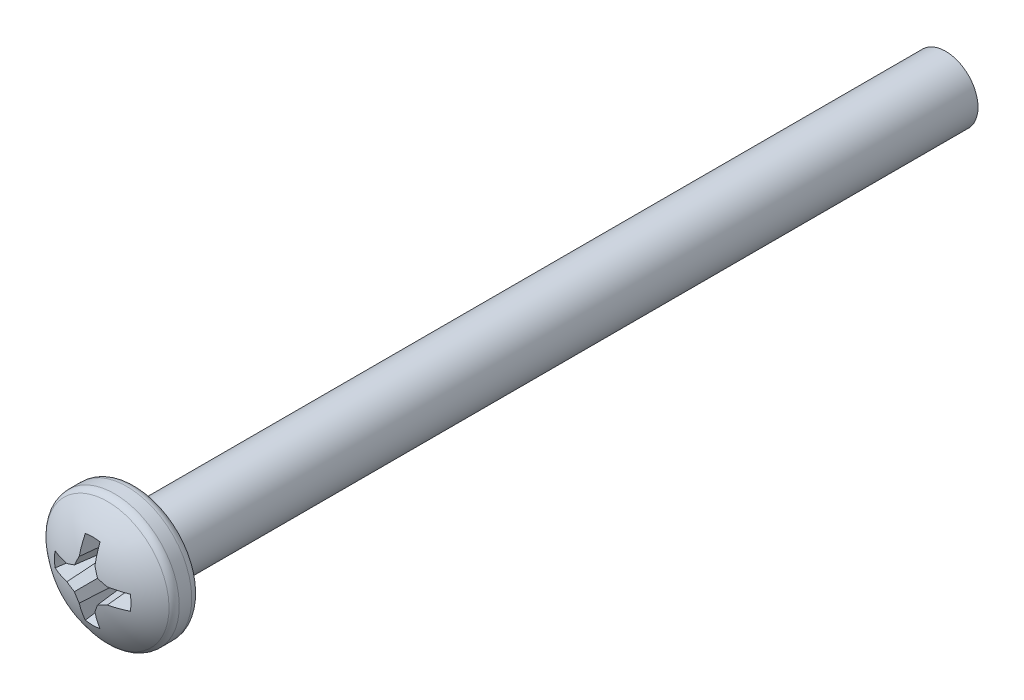
ISO-10303-21;
HEADER;
FILE_DESCRIPTION(('STEP AP214'),'2;1');
FILE_NAME('part.step','',(''),(''),'','','');
FILE_SCHEMA(('AUTOMOTIVE_DESIGN { 1 0 10303 214 1 1 1 1 }'));
ENDSEC;
DATA;
#1=APPLICATION_CONTEXT('core data for automotive mechanical design processes');
#2=APPLICATION_PROTOCOL_DEFINITION('international standard','automotive_design',2000,#1);
#3=PRODUCT_CONTEXT('',#1,'mechanical');
#4=PRODUCT('Part','Part','',(#3));
#5=PRODUCT_RELATED_PRODUCT_CATEGORY('part','',(#4));
#6=PRODUCT_DEFINITION_FORMATION('','',#4);
#7=PRODUCT_DEFINITION_CONTEXT('part definition',#1,'design');
#8=PRODUCT_DEFINITION('design','',#6,#7);
#9=PRODUCT_DEFINITION_SHAPE('','',#8);
#10=(LENGTH_UNIT() NAMED_UNIT(*) SI_UNIT(.MILLI.,.METRE.));
#11=(NAMED_UNIT(*) PLANE_ANGLE_UNIT() SI_UNIT($,.RADIAN.));
#12=(NAMED_UNIT(*) SI_UNIT($,.STERADIAN.) SOLID_ANGLE_UNIT());
#13=UNCERTAINTY_MEASURE_WITH_UNIT(LENGTH_MEASURE(1.E-05),#10,'distance_accuracy_value','');
#14=(GEOMETRIC_REPRESENTATION_CONTEXT(3) GLOBAL_UNCERTAINTY_ASSIGNED_CONTEXT((#13)) GLOBAL_UNIT_ASSIGNED_CONTEXT((#10,
#11,#12)) REPRESENTATION_CONTEXT('',''));
#15=CARTESIAN_POINT('',(0.,0.,0.));
#16=DIRECTION('',(0.,0.,1.));
#17=DIRECTION('',(1.,0.,0.));
#18=AXIS2_PLACEMENT_3D('',#15,#16,#17);
#19=CARTESIAN_POINT('',(0.,0.,50.));
#20=DIRECTION('',(0.,0.,-1.));
#21=DIRECTION('',(-1.,0.,0.));
#22=AXIS2_PLACEMENT_3D('',#19,#20,#21);
#23=PLANE('',#22);
#24=CARTESIAN_POINT('',(0.,0.,50.));
#25=DIRECTION('',(0.,0.,1.));
#26=DIRECTION('',(1.,0.,0.));
#27=AXIS2_PLACEMENT_3D('',#24,#25,#26);
#28=CIRCLE('',#27,1.99999999999999);
#29=CARTESIAN_POINT('',(1.99999999999999,0.,50.));
#30=VERTEX_POINT('',#29);
#31=EDGE_CURVE('E672',#30,#30,#28,.T.);
#32=ORIENTED_EDGE('',*,*,#31,.T.);
#33=EDGE_LOOP('',(#32));
#34=FACE_BOUND('',#33,.T.);
#35=CARTESIAN_POINT('',(0.,0.,50.));
#36=DIRECTION('',(0.,0.,1.));
#37=DIRECTION('',(0.,-1.,0.));
#38=AXIS2_PLACEMENT_3D('',#35,#36,#37);
#39=CIRCLE('',#38,3.424);
#40=CARTESIAN_POINT('',(0.,-3.42400000000001,50.));
#41=VERTEX_POINT('',#40);
#42=EDGE_CURVE('E658',#41,#41,#39,.T.);
#43=ORIENTED_EDGE('',*,*,#42,.F.);
#44=EDGE_LOOP('',(#43));
#45=FACE_BOUND('',#44,.T.);
#46=ADVANCED_FACE('F36',(#34,#45),#23,.T.);
#47=CARTESIAN_POINT('',(0.,0.,0.));
#48=DIRECTION('',(0.,0.,1.));
#49=DIRECTION('',(1.,0.,0.));
#50=AXIS2_PLACEMENT_3D('',#47,#48,#49);
#51=PLANE('',#50);
#52=CARTESIAN_POINT('',(0.,0.,0.));
#53=DIRECTION('',(0.,0.,1.));
#54=DIRECTION('',(1.,0.,0.));
#55=AXIS2_PLACEMENT_3D('',#52,#53,#54);
#56=CIRCLE('',#55,2.);
#57=CARTESIAN_POINT('',(2.,0.,0.));
#58=VERTEX_POINT('',#57);
#59=EDGE_CURVE('E386',#58,#58,#56,.T.);
#60=ORIENTED_EDGE('',*,*,#59,.F.);
#61=EDGE_LOOP('',(#60));
#62=FACE_BOUND('',#61,.T.);
#63=ADVANCED_FACE('F222',(#62),#51,.F.);
#64=CARTESIAN_POINT('',(0.,0.,0.));
#65=DIRECTION('',(0.,0.,1.));
#66=DIRECTION('',(1.,0.,0.));
#67=AXIS2_PLACEMENT_3D('',#64,#65,#66);
#68=CYLINDRICAL_SURFACE('',#67,2.);
#69=ORIENTED_EDGE('',*,*,#31,.F.);
#70=EDGE_LOOP('',(#69));
#71=FACE_BOUND('',#70,.T.);
#72=ORIENTED_EDGE('',*,*,#59,.T.);
#73=EDGE_LOOP('',(#72));
#74=FACE_BOUND('',#73,.T.);
#75=ADVANCED_FACE('F228',(#71,#74),#68,.T.);
#76=CARTESIAN_POINT('',(0.,0.,50.576));
#77=DIRECTION('',(0.,0.,1.));
#78=DIRECTION('',(0.,-1.,0.));
#79=AXIS2_PLACEMENT_3D('',#76,#77,#78);
#80=TOROIDAL_SURFACE('',#79,3.424,0.576000000000001);
#81=ORIENTED_EDGE('',*,*,#42,.T.);
#82=EDGE_LOOP('',(#81));
#83=FACE_BOUND('',#82,.T.);
#84=CARTESIAN_POINT('',(0.,0.,50.576));
#85=DIRECTION('',(0.,0.,1.));
#86=DIRECTION('',(0.,-1.,0.));
#87=AXIS2_PLACEMENT_3D('',#84,#85,#86);
#88=CIRCLE('',#87,4.);
#89=CARTESIAN_POINT('',(0.,-4.00000000000001,50.576));
#90=VERTEX_POINT('',#89);
#91=EDGE_CURVE('E661',#90,#90,#88,.T.);
#92=ORIENTED_EDGE('',*,*,#91,.F.);
#93=EDGE_LOOP('',(#92));
#94=FACE_BOUND('',#93,.T.);
#95=ADVANCED_FACE('F239',(#83,#94),#80,.T.);
#96=CARTESIAN_POINT('',(0.,0.,0.));
#97=DIRECTION('',(0.,0.,-1.));
#98=DIRECTION('',(-1.,0.,0.));
#99=AXIS2_PLACEMENT_3D('',#96,#97,#98);
#100=CYLINDRICAL_SURFACE('',#99,3.99999999999999);
#101=ORIENTED_EDGE('',*,*,#91,.T.);
#102=EDGE_LOOP('',(#101));
#103=FACE_BOUND('',#102,.T.);
#104=CARTESIAN_POINT('',(0.,0.,51.3454277334657));
#105=DIRECTION('',(0.,0.,1.));
#106=DIRECTION('',(0.,-1.,0.));
#107=AXIS2_PLACEMENT_3D('',#104,#105,#106);
#108=CIRCLE('',#107,4.);
#109=CARTESIAN_POINT('',(0.,-4.00000000000001,51.3454277334657));
#110=VERTEX_POINT('',#109);
#111=EDGE_CURVE('E662',#110,#110,#108,.T.);
#112=ORIENTED_EDGE('',*,*,#111,.F.);
#113=EDGE_LOOP('',(#112));
#114=FACE_BOUND('',#113,.T.);
#115=ADVANCED_FACE('F236',(#103,#114),#100,.T.);
#116=CARTESIAN_POINT('',(0.,0.,47.4));
#117=DIRECTION('',(0.,0.,1.));
#118=DIRECTION('',(0.,1.,0.));
#119=AXIS2_PLACEMENT_3D('',#116,#117,#118);
#120=SPHERICAL_SURFACE('',#119,5.80000000000001);
#121=CARTESIAN_POINT('',(0.,0.,52.6959475886136));
#122=DIRECTION('',(0.,0.,-1.));
#123=DIRECTION('',(-1.,0.,0.));
#124=AXIS2_PLACEMENT_3D('',#121,#122,#123);
#125=CIRCLE('',#124,2.36493956342605);
#126=CARTESIAN_POINT('',(2.32058037998715,-0.455901128180801,52.6959475886136));
#127=VERTEX_POINT('',#126);
#128=CARTESIAN_POINT('',(2.32058037998715,0.455901128180782,52.6959475886136));
#129=VERTEX_POINT('',#128);
#130=EDGE_CURVE('E374',#127,#129,#125,.F.);
#131=ORIENTED_EDGE('',*,*,#130,.F.);
#132=CARTESIAN_POINT('',(0.,0.00737777698104052,47.4006454718479));
#133=DIRECTION('',(0.,0.996194698091746,0.0871557427476585));
#134=DIRECTION('',(0.,-0.0871557427476585,0.996194698091746));
#135=AXIS2_PLACEMENT_3D('',#132,#133,#134);
#136=CIRCLE('',#135,5.79999527170265);
#137=CARTESIAN_POINT('',(1.24727453557005,-0.486298165036925,53.0433873097281));
#138=VERTEX_POINT('',#137);
#139=EDGE_CURVE('E11',#138,#127,#136,.T.);
#140=ORIENTED_EDGE('',*,*,#139,.F.);
#141=CARTESIAN_POINT('',(0.164389992388606,-0.396872549143005,47.362417341555));
#142=DIRECTION('',(-0.381227206369642,0.920363891963229,0.0871557427476586));
#143=DIRECTION('',(-0.923879532511292,-0.382683432365078,0.));
#144=AXIS2_PLACEMENT_3D('',#141,#142,#143);
#145=CIRCLE('',#144,5.78394810263056);
#146=CARTESIAN_POINT('',(0.713743336828413,-0.71374333682842,53.1114920028191));
#147=VERTEX_POINT('',#146);
#148=EDGE_CURVE('E46',#147,#138,#145,.T.);
#149=ORIENTED_EDGE('',*,*,#148,.F.);
#150=CARTESIAN_POINT('',(0.396872549143,-0.16438999238862,47.362417341555));
#151=DIRECTION('',(-0.920363891963226,0.381227206369651,0.0871557427476586));
#152=DIRECTION('',(-0.382683432365087,-0.923879532511288,0.));
#153=AXIS2_PLACEMENT_3D('',#150,#151,#152);
#154=CIRCLE('',#153,5.78394810263055);
#155=CARTESIAN_POINT('',(0.486298165036913,-1.24727453557006,53.0433873097281));
#156=VERTEX_POINT('',#155);
#157=EDGE_CURVE('E395',#156,#147,#154,.T.);
#158=ORIENTED_EDGE('',*,*,#157,.F.);
#159=CARTESIAN_POINT('',(-0.00737777698104454,0.,47.4006454718479));
#160=DIRECTION('',(-0.996194698091746,0.,0.0871557427476585));
#161=DIRECTION('',(0.0871557427476585,0.,0.996194698091746));
#162=AXIS2_PLACEMENT_3D('',#159,#160,#161);
#163=CIRCLE('',#162,5.79999527170265);
#164=CARTESIAN_POINT('',(0.455901128180782,-2.32058037998716,52.6959475886136));
#165=VERTEX_POINT('',#164);
#166=EDGE_CURVE('E354',#165,#156,#163,.T.);
#167=ORIENTED_EDGE('',*,*,#166,.F.);
#168=CARTESIAN_POINT('',(0.,0.,52.6959475886136));
#169=DIRECTION('',(0.,0.,-1.));
#170=DIRECTION('',(0.,1.,0.));
#171=AXIS2_PLACEMENT_3D('',#168,#169,#170);
#172=CIRCLE('',#171,2.36493956342605);
#173=CARTESIAN_POINT('',(-0.455901128180801,-2.32058037998716,52.6959475886136));
#174=VERTEX_POINT('',#173);
#175=EDGE_CURVE('E400',#174,#165,#172,.F.);
#176=ORIENTED_EDGE('',*,*,#175,.F.);
#177=CARTESIAN_POINT('',(0.00737777698104778,0.,47.4006454718479));
#178=DIRECTION('',(0.996194698091746,0.,0.0871557427476584));
#179=DIRECTION('',(0.0871557427476584,0.,-0.996194698091746));
#180=AXIS2_PLACEMENT_3D('',#177,#178,#179);
#181=CIRCLE('',#180,5.79999527170265);
#182=CARTESIAN_POINT('',(-0.486298165036921,-1.24727453557006,53.0433873097281));
#183=VERTEX_POINT('',#182);
#184=EDGE_CURVE('E334',#183,#174,#181,.T.);
#185=ORIENTED_EDGE('',*,*,#184,.F.);
#186=CARTESIAN_POINT('',(-0.396872549142998,-0.164389992388613,47.362417341555));
#187=DIRECTION('',(0.92036389196323,0.381227206369639,0.0871557427476585));
#188=DIRECTION('',(-0.382683432365075,0.923879532511293,0.));
#189=AXIS2_PLACEMENT_3D('',#186,#187,#188);
#190=CIRCLE('',#189,5.78394810263056);
#191=CARTESIAN_POINT('',(-0.713743336828414,-0.713743336828418,53.1114920028191));
#192=VERTEX_POINT('',#191);
#193=EDGE_CURVE('E416',#192,#183,#190,.T.);
#194=ORIENTED_EDGE('',*,*,#193,.F.);
#195=CARTESIAN_POINT('',(-0.164389992388613,-0.396872549143007,47.362417341555));
#196=DIRECTION('',(0.381227206369654,0.920363891963224,0.0871557427476586));
#197=DIRECTION('',(-0.923879532511287,0.38268343236509,0.));
#198=AXIS2_PLACEMENT_3D('',#195,#196,#197);
#199=CIRCLE('',#198,5.78394810263055);
#200=CARTESIAN_POINT('',(-1.24727453557005,-0.486298165036917,53.0433873097281));
#201=VERTEX_POINT('',#200);
#202=EDGE_CURVE('E417',#201,#192,#199,.T.);
#203=ORIENTED_EDGE('',*,*,#202,.F.);
#204=CARTESIAN_POINT('',(0.,0.00737777698103728,47.4006454718479));
#205=DIRECTION('',(0.,0.996194698091746,0.0871557427476587));
#206=DIRECTION('',(0.,-0.0871557427476587,0.996194698091746));
#207=AXIS2_PLACEMENT_3D('',#204,#205,#206);
#208=CIRCLE('',#207,5.79999527170265);
#209=CARTESIAN_POINT('',(-2.32058037998715,-0.455901128180781,52.6959475886136));
#210=VERTEX_POINT('',#209);
#211=EDGE_CURVE('E312',#210,#201,#208,.T.);
#212=ORIENTED_EDGE('',*,*,#211,.F.);
#213=CARTESIAN_POINT('',(0.,0.,52.6959475886136));
#214=DIRECTION('',(0.,0.,-1.));
#215=DIRECTION('',(-1.,0.,0.));
#216=AXIS2_PLACEMENT_3D('',#213,#214,#215);
#217=CIRCLE('',#216,2.36493956342605);
#218=CARTESIAN_POINT('',(-2.32058037998715,0.455901128180801,52.6959475886136));
#219=VERTEX_POINT('',#218);
#220=EDGE_CURVE('E189',#219,#210,#217,.F.);
#221=ORIENTED_EDGE('',*,*,#220,.F.);
#222=CARTESIAN_POINT('',(0.,-0.00737777698105494,47.4006454718479));
#223=DIRECTION('',(0.,-0.996194698091746,0.0871557427476582));
#224=DIRECTION('',(0.,-0.0871557427476582,-0.996194698091746));
#225=AXIS2_PLACEMENT_3D('',#222,#223,#224);
#226=CIRCLE('',#225,5.79999527170265);
#227=CARTESIAN_POINT('',(-1.24727453557005,0.486298165036918,53.0433873097281));
#228=VERTEX_POINT('',#227);
#229=EDGE_CURVE('E186',#228,#219,#226,.T.);
#230=ORIENTED_EDGE('',*,*,#229,.F.);
#231=CARTESIAN_POINT('',(-0.164389992388604,0.396872549142992,47.362417341555));
#232=DIRECTION('',(0.381227206369636,-0.920363891963232,0.0871557427476583));
#233=DIRECTION('',(0.923879532511294,0.382683432365072,0.));
#234=AXIS2_PLACEMENT_3D('',#231,#232,#233);
#235=CIRCLE('',#234,5.78394810263056);
#236=CARTESIAN_POINT('',(-0.713743336828408,0.713743336828408,53.1114920028191));
#237=VERTEX_POINT('',#236);
#238=EDGE_CURVE('E185',#237,#228,#235,.T.);
#239=ORIENTED_EDGE('',*,*,#238,.F.);
#240=CARTESIAN_POINT('',(-0.396872549142999,0.164389992388607,47.362417341555));
#241=DIRECTION('',(0.920363891963223,-0.381227206369657,0.0871557427476584));
#242=DIRECTION('',(0.382683432365094,0.923879532511285,0.));
#243=AXIS2_PLACEMENT_3D('',#240,#241,#242);
#244=CIRCLE('',#243,5.78394810263055);
#245=CARTESIAN_POINT('',(-0.486298165036904,1.24727453557004,53.0433873097281));
#246=VERTEX_POINT('',#245);
#247=EDGE_CURVE('E40',#246,#237,#244,.T.);
#248=ORIENTED_EDGE('',*,*,#247,.F.);
#249=CARTESIAN_POINT('',(0.00737777698104454,0.,47.4006454718479));
#250=DIRECTION('',(0.996194698091746,0.,0.0871557427476585));
#251=DIRECTION('',(0.0871557427476585,0.,-0.996194698091746));
#252=AXIS2_PLACEMENT_3D('',#249,#250,#251);
#253=CIRCLE('',#252,5.79999527170265);
#254=CARTESIAN_POINT('',(-0.455901128180765,2.32058037998715,52.6959475886136));
#255=VERTEX_POINT('',#254);
#256=EDGE_CURVE('E164',#255,#246,#253,.T.);
#257=ORIENTED_EDGE('',*,*,#256,.F.);
#258=CARTESIAN_POINT('',(0.,0.,52.6959475886136));
#259=DIRECTION('',(0.,0.,-1.));
#260=DIRECTION('',(-1.,0.,0.));
#261=AXIS2_PLACEMENT_3D('',#258,#259,#260);
#262=CIRCLE('',#261,2.36493956342605);
#263=CARTESIAN_POINT('',(0.455901128180785,2.32058037998714,52.6959475886136));
#264=VERTEX_POINT('',#263);
#265=EDGE_CURVE('E173',#264,#255,#262,.F.);
#266=ORIENTED_EDGE('',*,*,#265,.F.);
#267=CARTESIAN_POINT('',(-0.00737777698104778,0.,47.4006454718479));
#268=DIRECTION('',(-0.996194698091746,0.,0.0871557427476584));
#269=DIRECTION('',(0.0871557427476584,0.,0.996194698091746));
#270=AXIS2_PLACEMENT_3D('',#267,#268,#269);
#271=CIRCLE('',#270,5.79999527170265);
#272=CARTESIAN_POINT('',(0.486298165036913,1.24727453557005,53.0433873097281));
#273=VERTEX_POINT('',#272);
#274=EDGE_CURVE('E55',#273,#264,#271,.T.);
#275=ORIENTED_EDGE('',*,*,#274,.F.);
#276=CARTESIAN_POINT('',(0.396872549142998,0.1643899923886,47.362417341555));
#277=DIRECTION('',(-0.920363891963228,-0.381227206369645,0.0871557427476584));
#278=DIRECTION('',(0.382683432365081,-0.92387953251129,0.));
#279=AXIS2_PLACEMENT_3D('',#276,#277,#278);
#280=CIRCLE('',#279,5.78394810263056);
#281=CARTESIAN_POINT('',(0.713743336828409,0.713743336828407,53.1114920028191));
#282=VERTEX_POINT('',#281);
#283=EDGE_CURVE('E685',#282,#273,#280,.T.);
#284=ORIENTED_EDGE('',*,*,#283,.F.);
#285=CARTESIAN_POINT('',(0.164389992388611,0.396872549142993,47.362417341555));
#286=DIRECTION('',(-0.381227206369648,-0.920363891963227,0.0871557427476584));
#287=DIRECTION('',(0.923879532511289,-0.382683432365084,0.));
#288=AXIS2_PLACEMENT_3D('',#285,#286,#287);
#289=CIRCLE('',#288,5.78394810263055);
#290=CARTESIAN_POINT('',(1.24727453557005,0.486298165036909,53.0433873097281));
#291=VERTEX_POINT('',#290);
#292=EDGE_CURVE('E382',#291,#282,#289,.T.);
#293=ORIENTED_EDGE('',*,*,#292,.F.);
#294=CARTESIAN_POINT('',(0.,-0.00737777698105181,47.4006454718479));
#295=DIRECTION('',(0.,-0.996194698091746,0.0871557427476584));
#296=DIRECTION('',(0.,-0.0871557427476584,-0.996194698091746));
#297=AXIS2_PLACEMENT_3D('',#294,#295,#296);
#298=CIRCLE('',#297,5.79999527170265);
#299=EDGE_CURVE('E385',#129,#291,#298,.T.);
#300=ORIENTED_EDGE('',*,*,#299,.F.);
#301=EDGE_LOOP('',(#131,#140,#149,#158,#167,#176,#185,#194,#203,#212,#221,#230,#239,#248,#257,
#266,#275,#284,#293,#300));
#302=FACE_BOUND('',#301,.T.);
#303=CARTESIAN_POINT('',(0.,0.,51.7804519245982));
#304=DIRECTION('',(0.,0.,1.));
#305=DIRECTION('',(0.,-1.,0.));
#306=AXIS2_PLACEMENT_3D('',#303,#304,#305);
#307=CIRCLE('',#306,3.80153139356815);
#308=CARTESIAN_POINT('',(0.,-3.80153139356816,51.7804519245982));
#309=VERTEX_POINT('',#308);
#310=EDGE_CURVE('E665',#309,#309,#307,.T.);
#311=ORIENTED_EDGE('',*,*,#310,.T.);
#312=EDGE_LOOP('',(#311));
#313=FACE_BOUND('',#312,.T.);
#314=ADVANCED_FACE('F182',(#302,#313),#120,.T.);
#315=CARTESIAN_POINT('',(0.,0.,51.3454277334657));
#316=DIRECTION('',(0.,0.,1.));
#317=DIRECTION('',(0.,-1.,0.));
#318=AXIS2_PLACEMENT_3D('',#315,#316,#317);
#319=TOROIDAL_SURFACE('',#318,3.424,0.576000000000001);
#320=ORIENTED_EDGE('',*,*,#111,.T.);
#321=EDGE_LOOP('',(#320));
#322=FACE_BOUND('',#321,.T.);
#323=ORIENTED_EDGE('',*,*,#310,.F.);
#324=EDGE_LOOP('',(#323));
#325=FACE_BOUND('',#324,.T.);
#326=ADVANCED_FACE('F522',(#322,#325),#319,.T.);
#327=CARTESIAN_POINT('',(0.,0.,53.2));
#328=DIRECTION('',(0.,0.,1.));
#329=DIRECTION('',(1.,0.,0.));
#330=AXIS2_PLACEMENT_3D('',#327,#328,#329);
#331=CONICAL_SURFACE('',#330,2.5,0.26179938779915);
#332=ORIENTED_EDGE('',*,*,#265,.T.);
#333=CARTESIAN_POINT('',(-0.455901128180765,2.32058037998715,52.6959475886136));
#334=CARTESIAN_POINT('',(-0.42945692352768,2.24323332212006,52.3936889463239));
#335=CARTESIAN_POINT('',(-0.403014183455583,2.16582022264231,52.0914470442715));
#336=CARTESIAN_POINT('',(-0.350133305804645,2.01078871218393,51.4870158469054));
#337=CARTESIAN_POINT('',(-0.323695168221011,1.93317030141849,51.1848265515368));
#338=CARTESIAN_POINT('',(-0.270825094254857,1.77765472184549,50.5805188408528));
#339=CARTESIAN_POINT('',(-0.244393157876856,1.69975755283546,50.278400425589));
#340=CARTESIAN_POINT('',(-0.19153917510468,1.54352156747299,49.6742766380937));
#341=CARTESIAN_POINT('',(-0.165117128721233,1.46518275064298,49.3722712659849));
#342=CARTESIAN_POINT('',(-0.138701890712992,1.38654172119576,49.0703437139609));
#343=B_SPLINE_CURVE_WITH_KNOTS('',3,(#333,#334,#335,#336,#337,#338,#339,#340,#341,#342),
.UNSPECIFIED.,.F.,.F.,(4,2,2,2,4),(0.,0.939350523244521,1.87870006233806,2.81805028389258,
3.75740152141864),.UNSPECIFIED.);
#344=CARTESIAN_POINT('',(-0.262030835209472,1.75168834141974,50.48));
#345=VERTEX_POINT('',#344);
#346=EDGE_CURVE('E170',#345,#255,#343,.F.);
#347=ORIENTED_EDGE('',*,*,#346,.F.);
#348=CARTESIAN_POINT('',(0.,0.,50.48));
#349=DIRECTION('',(0.,0.,1.));
#350=DIRECTION('',(1.,0.,0.));
#351=AXIS2_PLACEMENT_3D('',#348,#349,#350);
#352=CIRCLE('',#351,1.77117819658734);
#353=CARTESIAN_POINT('',(0.262030835209486,1.75168834141973,50.48));
#354=VERTEX_POINT('',#353);
#355=EDGE_CURVE('E421',#354,#345,#352,.T.);
#356=ORIENTED_EDGE('',*,*,#355,.F.);
#357=CARTESIAN_POINT('',(0.724211320671619,3.10330239655258,55.7627471221478));
#358=CARTESIAN_POINT('',(0.685686065894718,2.9911280769368,55.3224014450706));
#359=CARTESIAN_POINT('',(0.647162079321012,2.87889635364682,54.8820702636223));
#360=CARTESIAN_POINT('',(0.570118290433082,2.65424486411923,54.0014557270303));
#361=CARTESIAN_POINT('',(0.531598488116955,2.54182509796749,53.561172371865));
#362=CARTESIAN_POINT('',(0.454564666991771,2.31672414559501,52.6806717673226));
#363=CARTESIAN_POINT('',(0.416050648184735,2.20404295928314,52.2404545179686));
#364=CARTESIAN_POINT('',(0.339032396157509,1.97824043261243,51.3601318690302));
#365=CARTESIAN_POINT('',(0.300528162941993,1.86511909204377,50.9200264694991));
#366=CARTESIAN_POINT('',(0.262030835209486,1.75168834141973,50.48));
#367=B_SPLINE_CURVE_WITH_KNOTS('',3,(#357,#358,#359,#360,#361,#362,#363,#364,#365,#366),
.UNSPECIFIED.,.F.,.F.,(4,2,2,2,4),(0.,1.36811707554726,2.73623352651274,4.10435045440113,
5.47246803448307),.UNSPECIFIED.);
#368=EDGE_CURVE('E667',#354,#264,#367,.F.);
#369=ORIENTED_EDGE('',*,*,#368,.T.);
#370=EDGE_LOOP('',(#332,#347,#356,#369));
#371=FACE_BOUND('',#370,.T.);
#372=ADVANCED_FACE('F251',(#371),#331,.F.);
#373=CARTESIAN_POINT('',(0.5,0.,53.2));
#374=DIRECTION('',(-0.996194698091746,0.,0.0871557427476584));
#375=DIRECTION('',(0.0871557427476584,0.,0.996194698091746));
#376=AXIS2_PLACEMENT_3D('',#373,#374,#375);
#377=PLANE('',#376);
#378=ORIENTED_EDGE('',*,*,#274,.T.);
#379=ORIENTED_EDGE('',*,*,#368,.F.);
#380=DIRECTION('',(0.,-1.,0.));
#381=VECTOR('',#380,1.);
#382=CARTESIAN_POINT('',(0.262030835209487,0.,50.48));
#383=LINE('',#382,#381);
#384=CARTESIAN_POINT('',(0.262030835209486,1.20266499006816,50.48));
#385=VERTEX_POINT('',#384);
#386=EDGE_CURVE('E423',#385,#354,#383,.F.);
#387=ORIENTED_EDGE('',*,*,#386,.F.);
#388=DIRECTION('',(0.0871426484044397,0.0173337504938598,0.996045029063886));
#389=VECTOR('',#388,1.);
#390=CARTESIAN_POINT('',(0.498111863843979,1.24962442636727,53.1784185049819));
#391=LINE('',#390,#389);
#392=EDGE_CURVE('E682',#385,#273,#391,.T.);
#393=ORIENTED_EDGE('',*,*,#392,.T.);
#394=EDGE_LOOP('',(#378,#379,#387,#393));
#395=FACE_BOUND('',#394,.T.);
#396=ADVANCED_FACE('F509',(#395),#377,.T.);
#397=CARTESIAN_POINT('',(0.868718433538224,0.359834957055033,53.2));
#398=DIRECTION('',(-0.920363891963228,-0.381227206369645,0.0871557427476584));
#399=DIRECTION('',(0.382683432365081,-0.92387953251129,0.));
#400=AXIS2_PLACEMENT_3D('',#397,#398,#399);
#401=PLANE('',#400);
#402=ORIENTED_EDGE('',*,*,#283,.T.);
#403=ORIENTED_EDGE('',*,*,#392,.F.);
#404=DIRECTION('',(0.382683432365081,-0.92387953251129,0.));
#405=VECTOR('',#404,1.);
#406=CARTESIAN_POINT('',(0.648863592819462,0.268768100275948,50.48));
#407=LINE('',#406,#405);
#408=CARTESIAN_POINT('',(0.53753620055191,0.537536200551908,50.48));
#409=VERTEX_POINT('',#408);
#410=EDGE_CURVE('E701',#409,#385,#407,.F.);
#411=ORIENTED_EDGE('',*,*,#410,.F.);
#412=DIRECTION('',(0.0666626913468327,0.0666626913468325,0.995546167269401));
#413=VECTOR('',#412,1.);
#414=CARTESIAN_POINT('',(0.71873319722088,0.718733197220878,53.1860109922053));
#415=LINE('',#414,#413);
#416=EDGE_CURVE('E679',#409,#282,#415,.T.);
#417=ORIENTED_EDGE('',*,*,#416,.T.);
#418=EDGE_LOOP('',(#402,#403,#411,#417));
#419=FACE_BOUND('',#418,.T.);
#420=ADVANCED_FACE('F341',(#419),#401,.T.);
#421=CARTESIAN_POINT('',(0.359834957055035,0.868718433538223,53.2));
#422=DIRECTION('',(-0.381227206369648,-0.920363891963227,0.0871557427476584));
#423=DIRECTION('',(0.923879532511289,-0.382683432365084,0.));
#424=AXIS2_PLACEMENT_3D('',#421,#422,#423);
#425=PLANE('',#424);
#426=ORIENTED_EDGE('',*,*,#292,.T.);
#427=ORIENTED_EDGE('',*,*,#416,.F.);
#428=DIRECTION('',(0.923879532511289,-0.382683432365084,0.));
#429=VECTOR('',#428,1.);
#430=CARTESIAN_POINT('',(0.268768100275949,0.648863592819461,50.48));
#431=LINE('',#430,#429);
#432=CARTESIAN_POINT('',(1.20266499006816,0.262030835209483,50.48));
#433=VERTEX_POINT('',#432);
#434=EDGE_CURVE('E379',#433,#409,#431,.F.);
#435=ORIENTED_EDGE('',*,*,#434,.F.);
#436=DIRECTION('',(0.01733375049386,0.0871426484044397,0.996045029063886));
#437=VECTOR('',#436,1.);
#438=CARTESIAN_POINT('',(1.25028949446948,0.501455386979155,53.2166351492926));
#439=LINE('',#438,#437);
#440=EDGE_CURVE('E676',#433,#291,#439,.T.);
#441=ORIENTED_EDGE('',*,*,#440,.T.);
#442=EDGE_LOOP('',(#426,#427,#435,#441));
#443=FACE_BOUND('',#442,.T.);
#444=ADVANCED_FACE('F495',(#443),#425,.T.);
#445=CARTESIAN_POINT('',(0.,0.499999999999996,53.2));
#446=DIRECTION('',(0.,-0.996194698091746,0.0871557427476584));
#447=DIRECTION('',(0.,-0.0871557427476584,-0.996194698091746));
#448=AXIS2_PLACEMENT_3D('',#445,#446,#447);
#449=PLANE('',#448);
#450=ORIENTED_EDGE('',*,*,#299,.T.);
#451=ORIENTED_EDGE('',*,*,#440,.F.);
#452=DIRECTION('',(1.,0.,0.));
#453=VECTOR('',#452,1.);
#454=CARTESIAN_POINT('',(0.,0.262030835209483,50.48));
#455=LINE('',#454,#453);
#456=CARTESIAN_POINT('',(1.75168834141973,0.262030835209483,50.48));
#457=VERTEX_POINT('',#456);
#458=EDGE_CURVE('E377',#457,#433,#455,.F.);
#459=ORIENTED_EDGE('',*,*,#458,.F.);
#460=CARTESIAN_POINT('',(2.32058037998715,0.455901128180782,52.6959475886136));
#461=CARTESIAN_POINT('',(2.24323332212006,0.429456923527696,52.3936889463239));
#462=CARTESIAN_POINT('',(2.1658202226423,0.403014183455598,52.0914470442715));
#463=CARTESIAN_POINT('',(2.01078871218392,0.350133305804658,51.4870158469054));
#464=CARTESIAN_POINT('',(1.93317030141848,0.323695168221024,51.1848265515368));
#465=CARTESIAN_POINT('',(1.77765472184549,0.270825094254868,50.5805188408528));
#466=CARTESIAN_POINT('',(1.69975755283545,0.244393157876867,50.278400425589));
#467=CARTESIAN_POINT('',(1.54352156747299,0.191539175104689,49.6742766380937));
#468=CARTESIAN_POINT('',(1.46518275064298,0.165117128721241,49.3722712659849));
#469=CARTESIAN_POINT('',(1.38654172119576,0.138701890712999,49.0703437139609));
#470=B_SPLINE_CURVE_WITH_KNOTS('',3,(#460,#461,#462,#463,#464,#465,#466,#467,#468,#469),
.UNSPECIFIED.,.F.,.F.,(4,2,2,2,4),(0.,0.939350523244521,1.87870006233806,2.81805028389258,
3.75740152141864),.UNSPECIFIED.);
#471=EDGE_CURVE('E256',#457,#129,#470,.F.);
#472=ORIENTED_EDGE('',*,*,#471,.T.);
#473=EDGE_LOOP('',(#450,#451,#459,#472));
#474=FACE_BOUND('',#473,.T.);
#475=ADVANCED_FACE('F249',(#474),#449,.T.);
#476=CARTESIAN_POINT('',(0.,0.,53.2));
#477=DIRECTION('',(0.,0.,1.));
#478=DIRECTION('',(1.,0.,0.));
#479=AXIS2_PLACEMENT_3D('',#476,#477,#478);
#480=CONICAL_SURFACE('',#479,2.5,0.26179938779915);
#481=ORIENTED_EDGE('',*,*,#130,.T.);
#482=ORIENTED_EDGE('',*,*,#471,.F.);
#483=CARTESIAN_POINT('',(0.,0.,50.48));
#484=DIRECTION('',(0.,0.,1.));
#485=DIRECTION('',(1.,0.,0.));
#486=AXIS2_PLACEMENT_3D('',#483,#484,#485);
#487=CIRCLE('',#486,1.77117819658734);
#488=CARTESIAN_POINT('',(1.75168834141973,-0.2620308352095,50.48));
#489=VERTEX_POINT('',#488);
#490=EDGE_CURVE('E272',#489,#457,#487,.T.);
#491=ORIENTED_EDGE('',*,*,#490,.F.);
#492=CARTESIAN_POINT('',(3.10330239655258,-0.724211320671639,55.7627471221478));
#493=CARTESIAN_POINT('',(2.9911280769368,-0.685686065894737,55.3224014450706));
#494=CARTESIAN_POINT('',(2.87889635364681,-0.647162079321031,54.8820702636223));
#495=CARTESIAN_POINT('',(2.65424486411922,-0.570118290433099,54.0014557270303));
#496=CARTESIAN_POINT('',(2.54182509796749,-0.531598488116972,53.561172371865));
#497=CARTESIAN_POINT('',(2.316724145595,-0.454564666991787,52.6806717673226));
#498=CARTESIAN_POINT('',(2.20404295928314,-0.41605064818475,52.2404545179686));
#499=CARTESIAN_POINT('',(1.97824043261242,-0.339032396157524,51.3601318690302));
#500=CARTESIAN_POINT('',(1.86511909204377,-0.300528162942007,50.9200264694991));
#501=CARTESIAN_POINT('',(1.75168834141973,-0.2620308352095,50.48));
#502=B_SPLINE_CURVE_WITH_KNOTS('',3,(#492,#493,#494,#495,#496,#497,#498,#499,#500,#501),
.UNSPECIFIED.,.F.,.F.,(4,2,2,2,4),(0.,1.36811707554726,2.73623352651274,4.10435045440113,
5.47246803448307),.UNSPECIFIED.);
#503=EDGE_CURVE('E264',#489,#127,#502,.F.);
#504=ORIENTED_EDGE('',*,*,#503,.T.);
#505=EDGE_LOOP('',(#481,#482,#491,#504));
#506=FACE_BOUND('',#505,.T.);
#507=ADVANCED_FACE('F244',(#506),#480,.F.);
#508=CARTESIAN_POINT('',(0.,0.,50.48));
#509=DIRECTION('',(0.,0.,1.));
#510=DIRECTION('',(1.,0.,0.));
#511=AXIS2_PLACEMENT_3D('',#508,#509,#510);
#512=PLANE('',#511);
#513=DIRECTION('',(-1.,0.,0.));
#514=VECTOR('',#513,1.);
#515=CARTESIAN_POINT('',(0.,-0.262030835209494,50.48));
#516=LINE('',#515,#514);
#517=CARTESIAN_POINT('',(1.20266499006817,-0.262030835209498,50.48));
#518=VERTEX_POINT('',#517);
#519=EDGE_CURVE('E274',#518,#489,#516,.F.);
#520=ORIENTED_EDGE('',*,*,#519,.T.);
#521=ORIENTED_EDGE('',*,*,#490,.T.);
#522=ORIENTED_EDGE('',*,*,#458,.T.);
#523=ORIENTED_EDGE('',*,*,#434,.T.);
#524=ORIENTED_EDGE('',*,*,#410,.T.);
#525=ORIENTED_EDGE('',*,*,#386,.T.);
#526=ORIENTED_EDGE('',*,*,#355,.T.);
#527=DIRECTION('',(0.,1.,0.));
#528=VECTOR('',#527,1.);
#529=CARTESIAN_POINT('',(-0.26203083520949,0.,50.48));
#530=LINE('',#529,#528);
#531=CARTESIAN_POINT('',(-0.262030835209478,1.20266499006815,50.48));
#532=VERTEX_POINT('',#531);
#533=EDGE_CURVE('E434',#345,#532,#530,.F.);
#534=ORIENTED_EDGE('',*,*,#533,.T.);
#535=DIRECTION('',(0.382683432365094,0.923879532511285,0.));
#536=VECTOR('',#535,1.);
#537=CARTESIAN_POINT('',(-0.648863592819462,0.268768100275958,50.48));
#538=LINE('',#537,#536);
#539=CARTESIAN_POINT('',(-0.53753620055191,0.537536200551908,50.48));
#540=VERTEX_POINT('',#539);
#541=EDGE_CURVE('E177',#532,#540,#538,.F.);
#542=ORIENTED_EDGE('',*,*,#541,.T.);
#543=DIRECTION('',(0.923879532511294,0.382683432365072,0.));
#544=VECTOR('',#543,1.);
#545=CARTESIAN_POINT('',(-0.268768100275939,0.648863592819461,50.48));
#546=LINE('',#545,#544);
#547=CARTESIAN_POINT('',(-1.20266499006816,0.262030835209491,50.48));
#548=VERTEX_POINT('',#547);
#549=EDGE_CURVE('E436',#540,#548,#546,.F.);
#550=ORIENTED_EDGE('',*,*,#549,.T.);
#551=DIRECTION('',(1.,0.,0.));
#552=VECTOR('',#551,1.);
#553=CARTESIAN_POINT('',(0.,0.262030835209479,50.48));
#554=LINE('',#553,#552);
#555=CARTESIAN_POINT('',(-1.75168834141973,0.262030835209497,50.48));
#556=VERTEX_POINT('',#555);
#557=EDGE_CURVE('E203',#548,#556,#554,.F.);
#558=ORIENTED_EDGE('',*,*,#557,.T.);
#559=CARTESIAN_POINT('',(0.,0.,50.48));
#560=DIRECTION('',(0.,0.,1.));
#561=DIRECTION('',(1.,0.,0.));
#562=AXIS2_PLACEMENT_3D('',#559,#560,#561);
#563=CIRCLE('',#562,1.77117819658735);
#564=CARTESIAN_POINT('',(-1.75168834141974,-0.262030835209486,50.48));
#565=VERTEX_POINT('',#564);
#566=EDGE_CURVE('E201',#556,#565,#563,.T.);
#567=ORIENTED_EDGE('',*,*,#566,.T.);
#568=DIRECTION('',(-1.,0.,0.));
#569=VECTOR('',#568,1.);
#570=CARTESIAN_POINT('',(0.,-0.262030835209498,50.48));
#571=LINE('',#570,#569);
#572=CARTESIAN_POINT('',(-1.20266499006816,-0.26203083520949,50.48));
#573=VERTEX_POINT('',#572);
#574=EDGE_CURVE('E314',#565,#573,#571,.F.);
#575=ORIENTED_EDGE('',*,*,#574,.T.);
#576=DIRECTION('',(-0.923879532511287,0.38268343236509,0.));
#577=VECTOR('',#576,1.);
#578=CARTESIAN_POINT('',(-0.26876810027596,-0.648863592819472,50.48));
#579=LINE('',#578,#577);
#580=CARTESIAN_POINT('',(-0.537536200551914,-0.53753620055192,50.48));
#581=VERTEX_POINT('',#580);
#582=EDGE_CURVE('E317',#573,#581,#579,.F.);
#583=ORIENTED_EDGE('',*,*,#582,.T.);
#584=DIRECTION('',(-0.382683432365075,0.923879532511293,0.));
#585=VECTOR('',#584,1.);
#586=CARTESIAN_POINT('',(-0.648863592819469,-0.268768100275946,50.48));
#587=LINE('',#586,#585);
#588=CARTESIAN_POINT('',(-0.262030835209495,-1.20266499006817,50.48));
#589=VERTEX_POINT('',#588);
#590=EDGE_CURVE('E320',#581,#589,#587,.F.);
#591=ORIENTED_EDGE('',*,*,#590,.T.);
#592=DIRECTION('',(0.,1.,0.));
#593=VECTOR('',#592,1.);
#594=CARTESIAN_POINT('',(-0.262030835209487,0.,50.48));
#595=LINE('',#594,#593);
#596=CARTESIAN_POINT('',(-0.262030835209498,-1.75168834141974,50.48));
#597=VERTEX_POINT('',#596);
#598=EDGE_CURVE('E311',#589,#597,#595,.F.);
#599=ORIENTED_EDGE('',*,*,#598,.T.);
#600=CARTESIAN_POINT('',(0.,0.,50.48));
#601=DIRECTION('',(0.,0.,1.));
#602=DIRECTION('',(1.,0.,0.));
#603=AXIS2_PLACEMENT_3D('',#600,#601,#602);
#604=CIRCLE('',#603,1.77117819658735);
#605=CARTESIAN_POINT('',(0.262030835209484,-1.75168834141974,50.48));
#606=VERTEX_POINT('',#605);
#607=EDGE_CURVE('E332',#597,#606,#604,.T.);
#608=ORIENTED_EDGE('',*,*,#607,.T.);
#609=DIRECTION('',(0.,-1.,0.));
#610=VECTOR('',#609,1.);
#611=CARTESIAN_POINT('',(0.26203083520949,0.,50.48));
#612=LINE('',#611,#610);
#613=CARTESIAN_POINT('',(0.262030835209486,-1.20266499006817,50.48));
#614=VERTEX_POINT('',#613);
#615=EDGE_CURVE('E356',#606,#614,#612,.F.);
#616=ORIENTED_EDGE('',*,*,#615,.T.);
#617=DIRECTION('',(-0.382683432365087,-0.923879532511288,0.));
#618=VECTOR('',#617,1.);
#619=CARTESIAN_POINT('',(0.64886359281947,-0.268768100275956,50.48));
#620=LINE('',#619,#618);
#621=CARTESIAN_POINT('',(0.537536200551914,-0.53753620055192,50.48));
#622=VERTEX_POINT('',#621);
#623=EDGE_CURVE('E359',#614,#622,#620,.F.);
#624=ORIENTED_EDGE('',*,*,#623,.T.);
#625=DIRECTION('',(-0.923879532511292,-0.382683432365078,0.));
#626=VECTOR('',#625,1.);
#627=CARTESIAN_POINT('',(0.268768100275949,-0.648863592819472,50.48));
#628=LINE('',#627,#626);
#629=EDGE_CURVE('E361',#622,#518,#628,.F.);
#630=ORIENTED_EDGE('',*,*,#629,.T.);
#631=EDGE_LOOP('',(#520,#521,#522,#523,#524,#525,#526,#534,#542,#550,#558,#567,#575,#583,#591,
#599,#608,#616,#624,#630));
#632=FACE_BOUND('',#631,.T.);
#633=ADVANCED_FACE('F248',(#632),#512,.T.);
#634=CARTESIAN_POINT('',(0.,-0.500000000000009,53.2));
#635=DIRECTION('',(0.,0.996194698091746,0.0871557427476585));
#636=DIRECTION('',(0.,-0.0871557427476585,0.996194698091746));
#637=AXIS2_PLACEMENT_3D('',#634,#635,#636);
#638=PLANE('',#637);
#639=ORIENTED_EDGE('',*,*,#139,.T.);
#640=ORIENTED_EDGE('',*,*,#503,.F.);
#641=ORIENTED_EDGE('',*,*,#519,.F.);
#642=DIRECTION('',(0.0173337504938597,-0.0871426484044399,0.996045029063886));
#643=VECTOR('',#642,1.);
#644=CARTESIAN_POINT('',(1.24962442636728,-0.498111863843992,53.1784185049819));
#645=LINE('',#644,#643);
#646=EDGE_CURVE('E273',#518,#138,#645,.T.);
#647=ORIENTED_EDGE('',*,*,#646,.T.);
#648=EDGE_LOOP('',(#639,#640,#641,#647));
#649=FACE_BOUND('',#648,.T.);
#650=ADVANCED_FACE('F277',(#649),#638,.T.);
#651=CARTESIAN_POINT('',(0.359834957055039,-0.868718433538234,53.2));
#652=DIRECTION('',(-0.381227206369642,0.920363891963229,0.0871557427476586));
#653=DIRECTION('',(-0.923879532511292,-0.382683432365078,0.));
#654=AXIS2_PLACEMENT_3D('',#651,#652,#653);
#655=PLANE('',#654);
#656=ORIENTED_EDGE('',*,*,#148,.T.);
#657=ORIENTED_EDGE('',*,*,#646,.F.);
#658=ORIENTED_EDGE('',*,*,#629,.F.);
#659=DIRECTION('',(0.0666626913468324,-0.066662691346833,0.995546167269401));
#660=VECTOR('',#659,1.);
#661=CARTESIAN_POINT('',(0.718733197220884,-0.718733197220891,53.1860109922053));
#662=LINE('',#661,#660);
#663=EDGE_CURVE('E389',#622,#147,#662,.T.);
#664=ORIENTED_EDGE('',*,*,#663,.T.);
#665=EDGE_LOOP('',(#656,#657,#658,#664));
#666=FACE_BOUND('',#665,.T.);
#667=ADVANCED_FACE('F281',(#666),#655,.T.);
#668=CARTESIAN_POINT('',(0.86871843353823,-0.359834957055047,53.2));
#669=DIRECTION('',(-0.920363891963226,0.381227206369651,0.0871557427476586));
#670=DIRECTION('',(-0.382683432365087,-0.923879532511288,0.));
#671=AXIS2_PLACEMENT_3D('',#668,#669,#670);
#672=PLANE('',#671);
#673=ORIENTED_EDGE('',*,*,#157,.T.);
#674=ORIENTED_EDGE('',*,*,#663,.F.);
#675=ORIENTED_EDGE('',*,*,#623,.F.);
#676=DIRECTION('',(0.0871426484044398,-0.0173337504938604,0.996045029063886));
#677=VECTOR('',#676,1.);
#678=CARTESIAN_POINT('',(0.501455386979159,-1.25028949446949,53.2166351492926));
#679=LINE('',#678,#677);
#680=EDGE_CURVE('E353',#614,#156,#679,.T.);
#681=ORIENTED_EDGE('',*,*,#680,.T.);
#682=EDGE_LOOP('',(#673,#674,#675,#681));
#683=FACE_BOUND('',#682,.T.);
#684=ADVANCED_FACE('F285',(#683),#672,.T.);
#685=CARTESIAN_POINT('',(0.500000000000005,0.,53.2));
#686=DIRECTION('',(-0.996194698091746,0.,0.0871557427476585));
#687=DIRECTION('',(0.0871557427476585,0.,0.996194698091746));
#688=AXIS2_PLACEMENT_3D('',#685,#686,#687);
#689=PLANE('',#688);
#690=ORIENTED_EDGE('',*,*,#166,.T.);
#691=ORIENTED_EDGE('',*,*,#680,.F.);
#692=ORIENTED_EDGE('',*,*,#615,.F.);
#693=CARTESIAN_POINT('',(0.455901128180782,-2.32058037998716,52.6959475886136));
#694=CARTESIAN_POINT('',(0.429456923527697,-2.24323332212007,52.3936889463239));
#695=CARTESIAN_POINT('',(0.403014183455599,-2.16582022264232,52.0914470442715));
#696=CARTESIAN_POINT('',(0.35013330580466,-2.01078871218394,51.4870158469054));
#697=CARTESIAN_POINT('',(0.323695168221025,-1.93317030141849,51.1848265515368));
#698=CARTESIAN_POINT('',(0.27082509425487,-1.7776547218455,50.5805188408528));
#699=CARTESIAN_POINT('',(0.244393157876868,-1.69975755283546,50.278400425589));
#700=CARTESIAN_POINT('',(0.191539175104691,-1.543521567473,49.6742766380937));
#701=CARTESIAN_POINT('',(0.165117128721244,-1.46518275064299,49.3722712659849));
#702=CARTESIAN_POINT('',(0.138701890713002,-1.38654172119576,49.0703437139609));
#703=B_SPLINE_CURVE_WITH_KNOTS('',3,(#693,#694,#695,#696,#697,#698,#699,#700,#701,#702),
.UNSPECIFIED.,.F.,.F.,(4,2,2,2,4),(0.,0.939350523244521,1.87870006233806,2.81805028389258,
3.75740152141864),.UNSPECIFIED.);
#704=EDGE_CURVE('E345',#606,#165,#703,.F.);
#705=ORIENTED_EDGE('',*,*,#704,.T.);
#706=EDGE_LOOP('',(#690,#691,#692,#705));
#707=FACE_BOUND('',#706,.T.);
#708=ADVANCED_FACE('F283',(#707),#689,.T.);
#709=CARTESIAN_POINT('',(0.,0.,53.2));
#710=DIRECTION('',(0.,0.,1.));
#711=DIRECTION('',(0.,-1.,0.));
#712=AXIS2_PLACEMENT_3D('',#709,#710,#711);
#713=CONICAL_SURFACE('',#712,2.5,0.26179938779915);
#714=ORIENTED_EDGE('',*,*,#175,.T.);
#715=ORIENTED_EDGE('',*,*,#704,.F.);
#716=ORIENTED_EDGE('',*,*,#607,.F.);
#717=CARTESIAN_POINT('',(-0.724211320671642,-3.10330239655259,55.7627471221478));
#718=CARTESIAN_POINT('',(-0.68568606589474,-2.99112807693681,55.3224014450706));
#719=CARTESIAN_POINT('',(-0.647162079321033,-2.87889635364682,54.8820702636223));
#720=CARTESIAN_POINT('',(-0.570118290433101,-2.65424486411923,54.0014557270303));
#721=CARTESIAN_POINT('',(-0.531598488116973,-2.54182509796749,53.561172371865));
#722=CARTESIAN_POINT('',(-0.454564666991787,-2.31672414559501,52.6806717673226));
#723=CARTESIAN_POINT('',(-0.41605064818475,-2.20404295928315,52.2404545179686));
#724=CARTESIAN_POINT('',(-0.339032396157523,-1.97824043261243,51.3601318690302));
#725=CARTESIAN_POINT('',(-0.300528162942006,-1.86511909204377,50.9200264694991));
#726=CARTESIAN_POINT('',(-0.262030835209498,-1.75168834141974,50.48));
#727=B_SPLINE_CURVE_WITH_KNOTS('',3,(#717,#718,#719,#720,#721,#722,#723,#724,#725,#726),
.UNSPECIFIED.,.F.,.F.,(4,2,2,2,4),(0.,1.36811707554726,2.73623352651275,4.10435045440114,
5.47246803448309),.UNSPECIFIED.);
#728=EDGE_CURVE('E325',#597,#174,#727,.F.);
#729=ORIENTED_EDGE('',*,*,#728,.T.);
#730=EDGE_LOOP('',(#714,#715,#716,#729));
#731=FACE_BOUND('',#730,.T.);
#732=ADVANCED_FACE('F336',(#731),#713,.F.);
#733=CARTESIAN_POINT('',(-0.5,0.,53.2));
#734=DIRECTION('',(0.996194698091746,0.,0.0871557427476584));
#735=DIRECTION('',(0.0871557427476584,0.,-0.996194698091746));
#736=AXIS2_PLACEMENT_3D('',#733,#734,#735);
#737=PLANE('',#736);
#738=ORIENTED_EDGE('',*,*,#184,.T.);
#739=ORIENTED_EDGE('',*,*,#728,.F.);
#740=ORIENTED_EDGE('',*,*,#598,.F.);
#741=DIRECTION('',(-0.0871426484044398,-0.0173337504938596,0.996045029063886));
#742=VECTOR('',#741,1.);
#743=CARTESIAN_POINT('',(-0.498111863843988,-1.24962442636728,53.1784185049819));
#744=LINE('',#743,#742);
#745=EDGE_CURVE('E333',#589,#183,#744,.T.);
#746=ORIENTED_EDGE('',*,*,#745,.T.);
#747=EDGE_LOOP('',(#738,#739,#740,#746));
#748=FACE_BOUND('',#747,.T.);
#749=ADVANCED_FACE('F298',(#748),#737,.T.);
#750=CARTESIAN_POINT('',(-0.868718433538226,-0.359834957055044,53.2));
#751=DIRECTION('',(0.92036389196323,0.381227206369639,0.0871557427476585));
#752=DIRECTION('',(-0.382683432365075,0.923879532511293,0.));
#753=AXIS2_PLACEMENT_3D('',#750,#751,#752);
#754=PLANE('',#753);
#755=ORIENTED_EDGE('',*,*,#193,.T.);
#756=ORIENTED_EDGE('',*,*,#745,.F.);
#757=ORIENTED_EDGE('',*,*,#590,.F.);
#758=DIRECTION('',(-0.0666626913468331,-0.0666626913468323,0.995546167269401));
#759=VECTOR('',#758,1.);
#760=CARTESIAN_POINT('',(-0.718733197220885,-0.71873319722089,53.1860109922053));
#761=LINE('',#760,#759);
#762=EDGE_CURVE('E404',#581,#192,#761,.T.);
#763=ORIENTED_EDGE('',*,*,#762,.T.);
#764=EDGE_LOOP('',(#755,#756,#757,#763));
#765=FACE_BOUND('',#764,.T.);
#766=ADVANCED_FACE('F448',(#765),#754,.T.);
#767=CARTESIAN_POINT('',(-0.359834957055042,-0.868718433538237,53.2));
#768=DIRECTION('',(0.381227206369654,0.920363891963224,0.0871557427476586));
#769=DIRECTION('',(-0.923879532511287,0.38268343236509,0.));
#770=AXIS2_PLACEMENT_3D('',#767,#768,#769);
#771=PLANE('',#770);
#772=ORIENTED_EDGE('',*,*,#202,.T.);
#773=ORIENTED_EDGE('',*,*,#762,.F.);
#774=ORIENTED_EDGE('',*,*,#582,.F.);
#775=DIRECTION('',(-0.0173337504938605,-0.0871426484044399,0.996045029063886));
#776=VECTOR('',#775,1.);
#777=CARTESIAN_POINT('',(-1.25028949446948,-0.501455386979163,53.2166351492926));
#778=LINE('',#777,#776);
#779=EDGE_CURVE('E310',#573,#201,#778,.T.);
#780=ORIENTED_EDGE('',*,*,#779,.T.);
#781=EDGE_LOOP('',(#772,#773,#774,#780));
#782=FACE_BOUND('',#781,.T.);
#783=ADVANCED_FACE('F296',(#782),#771,.T.);
#784=CARTESIAN_POINT('',(0.,-0.500000000000013,53.2));
#785=DIRECTION('',(0.,0.996194698091746,0.0871557427476587));
#786=DIRECTION('',(0.,-0.0871557427476587,0.996194698091746));
#787=AXIS2_PLACEMENT_3D('',#784,#785,#786);
#788=PLANE('',#787);
#789=ORIENTED_EDGE('',*,*,#211,.T.);
#790=ORIENTED_EDGE('',*,*,#779,.F.);
#791=ORIENTED_EDGE('',*,*,#574,.F.);
#792=CARTESIAN_POINT('',(-2.32058037998716,-0.455901128180781,52.6959475886136));
#793=CARTESIAN_POINT('',(-2.24323332212006,-0.429456923527696,52.3936889463239));
#794=CARTESIAN_POINT('',(-2.16582022264231,-0.403014183455599,52.0914470442715));
#795=CARTESIAN_POINT('',(-2.01078871218393,-0.35013330580466,51.4870158469054));
#796=CARTESIAN_POINT('',(-1.93317030141849,-0.323695168221026,51.1848265515368));
#797=CARTESIAN_POINT('',(-1.77765472184549,-0.270825094254871,50.5805188408528));
#798=CARTESIAN_POINT('',(-1.69975755283546,-0.24439315787687,50.278400425589));
#799=CARTESIAN_POINT('',(-1.54352156747299,-0.191539175104693,49.6742766380937));
#800=CARTESIAN_POINT('',(-1.46518275064298,-0.165117128721246,49.3722712659849));
#801=CARTESIAN_POINT('',(-1.38654172119576,-0.138701890713005,49.0703437139609));
#802=B_SPLINE_CURVE_WITH_KNOTS('',3,(#792,#793,#794,#795,#796,#797,#798,#799,#800,#801),
.UNSPECIFIED.,.F.,.F.,(4,2,2,2,4),(0.,0.939350523244521,1.87870006233806,2.81805028389258,
3.75740152141864),.UNSPECIFIED.);
#803=EDGE_CURVE('E302',#565,#210,#802,.F.);
#804=ORIENTED_EDGE('',*,*,#803,.T.);
#805=EDGE_LOOP('',(#789,#790,#791,#804));
#806=FACE_BOUND('',#805,.T.);
#807=ADVANCED_FACE('F292',(#806),#788,.T.);
#808=CARTESIAN_POINT('',(0.,0.,53.2));
#809=DIRECTION('',(0.,0.,1.));
#810=DIRECTION('',(1.,0.,0.));
#811=AXIS2_PLACEMENT_3D('',#808,#809,#810);
#812=CONICAL_SURFACE('',#811,2.5,0.26179938779915);
#813=ORIENTED_EDGE('',*,*,#220,.T.);
#814=ORIENTED_EDGE('',*,*,#803,.F.);
#815=ORIENTED_EDGE('',*,*,#566,.F.);
#816=CARTESIAN_POINT('',(-3.10330239655258,0.724211320671644,55.7627471221478));
#817=CARTESIAN_POINT('',(-2.9911280769368,0.685686065894742,55.3224014450706));
#818=CARTESIAN_POINT('',(-2.87889635364681,0.647162079321035,54.8820702636223));
#819=CARTESIAN_POINT('',(-2.65424486411922,0.570118290433102,54.0014557270303));
#820=CARTESIAN_POINT('',(-2.54182509796748,0.531598488116974,53.561172371865));
#821=CARTESIAN_POINT('',(-2.316724145595,0.454564666991787,52.6806717673226));
#822=CARTESIAN_POINT('',(-2.20404295928314,0.41605064818475,52.2404545179686));
#823=CARTESIAN_POINT('',(-1.97824043261242,0.339032396157522,51.3601318690302));
#824=CARTESIAN_POINT('',(-1.86511909204376,0.300528162942005,50.9200264694991));
#825=CARTESIAN_POINT('',(-1.75168834141973,0.262030835209496,50.48));
#826=B_SPLINE_CURVE_WITH_KNOTS('',3,(#816,#817,#818,#819,#820,#821,#822,#823,#824,#825),
.UNSPECIFIED.,.F.,.F.,(4,2,2,2,4),(0.,1.36811707554726,2.73623352651275,4.10435045440114,
5.47246803448309),.UNSPECIFIED.);
#827=EDGE_CURVE('E192',#556,#219,#826,.F.);
#828=ORIENTED_EDGE('',*,*,#827,.T.);
#829=EDGE_LOOP('',(#813,#814,#815,#828));
#830=FACE_BOUND('',#829,.T.);
#831=ADVANCED_FACE('F205',(#830),#812,.F.);
#832=CARTESIAN_POINT('',(0.,0.499999999999992,53.2));
#833=DIRECTION('',(0.,-0.996194698091746,0.0871557427476582));
#834=DIRECTION('',(0.,-0.0871557427476582,-0.996194698091746));
#835=AXIS2_PLACEMENT_3D('',#832,#833,#834);
#836=PLANE('',#835);
#837=ORIENTED_EDGE('',*,*,#229,.T.);
#838=ORIENTED_EDGE('',*,*,#827,.F.);
#839=ORIENTED_EDGE('',*,*,#557,.F.);
#840=DIRECTION('',(-0.0173337504938591,0.0871426484044397,0.996045029063886));
#841=VECTOR('',#840,1.);
#842=CARTESIAN_POINT('',(-1.24962442636727,0.498111863843984,53.1784185049819));
#843=LINE('',#842,#841);
#844=EDGE_CURVE('E202',#548,#228,#843,.T.);
#845=ORIENTED_EDGE('',*,*,#844,.T.);
#846=EDGE_LOOP('',(#837,#838,#839,#845));
#847=FACE_BOUND('',#846,.T.);
#848=ADVANCED_FACE('F209',(#847),#836,.T.);
#849=CARTESIAN_POINT('',(-0.359834957055032,0.86871843353822,53.2));
#850=DIRECTION('',(0.381227206369636,-0.920363891963232,0.0871557427476583));
#851=DIRECTION('',(0.923879532511294,0.382683432365072,0.));
#852=AXIS2_PLACEMENT_3D('',#849,#850,#851);
#853=PLANE('',#852);
#854=ORIENTED_EDGE('',*,*,#238,.T.);
#855=ORIENTED_EDGE('',*,*,#844,.F.);
#856=ORIENTED_EDGE('',*,*,#549,.F.);
#857=DIRECTION('',(-0.0666626913468319,0.0666626913468332,0.995546167269401));
#858=VECTOR('',#857,1.);
#859=CARTESIAN_POINT('',(-0.718733197220879,0.71873319722088,53.1860109922053));
#860=LINE('',#859,#858);
#861=EDGE_CURVE('E179',#540,#237,#860,.T.);
#862=ORIENTED_EDGE('',*,*,#861,.T.);
#863=EDGE_LOOP('',(#854,#855,#856,#862));
#864=FACE_BOUND('',#863,.T.);
#865=ADVANCED_FACE('F38',(#864),#853,.T.);
#866=CARTESIAN_POINT('',(-0.868718433538227,0.359834957055036,53.2));
#867=DIRECTION('',(0.920363891963223,-0.381227206369657,0.0871557427476584));
#868=DIRECTION('',(0.382683432365094,0.923879532511285,0.));
#869=AXIS2_PLACEMENT_3D('',#866,#867,#868);
#870=PLANE('',#869);
#871=ORIENTED_EDGE('',*,*,#247,.T.);
#872=ORIENTED_EDGE('',*,*,#861,.F.);
#873=ORIENTED_EDGE('',*,*,#541,.F.);
#874=DIRECTION('',(-0.0871426484044396,0.0173337504938608,0.996045029063886));
#875=VECTOR('',#874,1.);
#876=CARTESIAN_POINT('',(-0.50145538697915,1.25028949446948,53.2166351492926));
#877=LINE('',#876,#875);
#878=EDGE_CURVE('E167',#532,#246,#877,.T.);
#879=ORIENTED_EDGE('',*,*,#878,.T.);
#880=EDGE_LOOP('',(#871,#872,#873,#879));
#881=FACE_BOUND('',#880,.T.);
#882=ADVANCED_FACE('F175',(#881),#870,.T.);
#883=CARTESIAN_POINT('',(-0.500000000000005,0.,53.2));
#884=DIRECTION('',(0.996194698091746,0.,0.0871557427476585));
#885=DIRECTION('',(0.0871557427476585,0.,-0.996194698091746));
#886=AXIS2_PLACEMENT_3D('',#883,#884,#885);
#887=PLANE('',#886);
#888=ORIENTED_EDGE('',*,*,#256,.T.);
#889=ORIENTED_EDGE('',*,*,#878,.F.);
#890=ORIENTED_EDGE('',*,*,#533,.F.);
#891=ORIENTED_EDGE('',*,*,#346,.T.);
#892=EDGE_LOOP('',(#888,#889,#890,#891));
#893=FACE_BOUND('',#892,.T.);
#894=ADVANCED_FACE('F165',(#893),#887,.T.);
#895=CLOSED_SHELL('',(#46,#63,#75,#95,#115,#314,#326,#372,#396,#420,#444,#475,#507,#633,#650,
#667,#684,#708,#732,#749,#766,#783,#807,#831,#848,#865,#882,#894));
#896=MANIFOLD_SOLID_BREP('B2',#895);
#897=ADVANCED_BREP_SHAPE_REPRESENTATION('',(#18,#896),#14);
#898=SHAPE_DEFINITION_REPRESENTATION(#9,#897);
ENDSEC;
END-ISO-10303-21;
